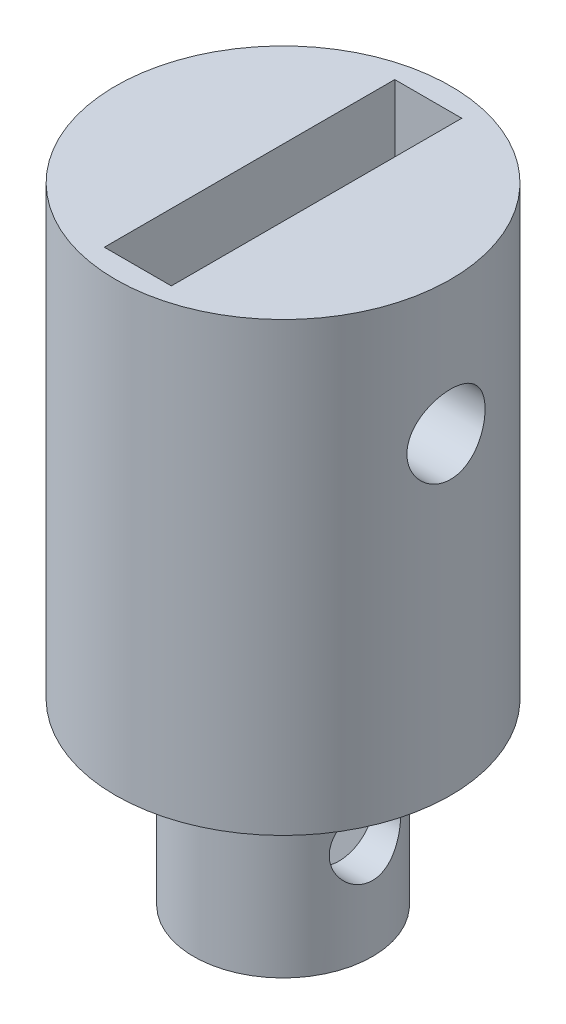
ISO-10303-21;
HEADER;
FILE_DESCRIPTION(('STEP AP214'),'2;1');
FILE_NAME('part.step','',(''),(''),'','','');
FILE_SCHEMA(('AUTOMOTIVE_DESIGN { 1 0 10303 214 1 1 1 1 }'));
ENDSEC;
DATA;
#1=APPLICATION_CONTEXT('core data for automotive mechanical design processes');
#2=APPLICATION_PROTOCOL_DEFINITION('international standard','automotive_design',2000,#1);
#3=PRODUCT_CONTEXT('',#1,'mechanical');
#4=PRODUCT('Part','Part','',(#3));
#5=PRODUCT_RELATED_PRODUCT_CATEGORY('part','',(#4));
#6=PRODUCT_DEFINITION_FORMATION('','',#4);
#7=PRODUCT_DEFINITION_CONTEXT('part definition',#1,'design');
#8=PRODUCT_DEFINITION('design','',#6,#7);
#9=PRODUCT_DEFINITION_SHAPE('','',#8);
#10=(LENGTH_UNIT() NAMED_UNIT(*) SI_UNIT(.MILLI.,.METRE.));
#11=(NAMED_UNIT(*) PLANE_ANGLE_UNIT() SI_UNIT($,.RADIAN.));
#12=(NAMED_UNIT(*) SI_UNIT($,.STERADIAN.) SOLID_ANGLE_UNIT());
#13=UNCERTAINTY_MEASURE_WITH_UNIT(LENGTH_MEASURE(1.E-05),#10,'distance_accuracy_value','');
#14=(GEOMETRIC_REPRESENTATION_CONTEXT(3) GLOBAL_UNCERTAINTY_ASSIGNED_CONTEXT((#13)) GLOBAL_UNIT_ASSIGNED_CONTEXT((#10,
#11,#12)) REPRESENTATION_CONTEXT('',''));
#15=CARTESIAN_POINT('',(0.,0.,0.));
#16=DIRECTION('',(0.,0.,1.));
#17=DIRECTION('',(1.,0.,0.));
#18=AXIS2_PLACEMENT_3D('',#15,#16,#17);
#19=CARTESIAN_POINT('',(0.,20.,0.));
#20=DIRECTION('',(0.,-1.,0.));
#21=DIRECTION('',(0.,0.,-1.));
#22=AXIS2_PLACEMENT_3D('',#19,#20,#21);
#23=CYLINDRICAL_SURFACE('',#22,7.5);
#24=CARTESIAN_POINT('',(-7.5,12.25,0.));
#25=CARTESIAN_POINT('',(-7.49999825577596,12.2500030618777,-0.0968920689760757));
#26=CARTESIAN_POINT('',(-7.4981034715083,12.2580740513045,-0.193819815225522));
#27=CARTESIAN_POINT('',(-7.49072806388341,12.2901045766339,-0.384910889611755));
#28=CARTESIAN_POINT('',(-7.48524511796865,12.3140744037268,-0.479072385923468));
#29=CARTESIAN_POINT('',(-7.47130237255715,12.3771021121917,-0.661842669774767));
#30=CARTESIAN_POINT('',(-7.46284589581215,12.4161431570795,-0.750457525699834));
#31=CARTESIAN_POINT('',(-7.44386329828026,12.5081489574349,-0.91987807027651));
#32=CARTESIAN_POINT('',(-7.43333717435647,12.5611137340062,-1.00068374709176));
#33=CARTESIAN_POINT('',(-7.41115055069133,12.6804779499764,-1.15365744906099));
#34=CARTESIAN_POINT('',(-7.39947439919204,12.7470816827131,-1.22566380724544));
#35=CARTESIAN_POINT('',(-7.37641108271656,12.891395128878,-1.35759154808836));
#36=CARTESIAN_POINT('',(-7.36502394655403,12.9691059445554,-1.41751172990911));
#37=CARTESIAN_POINT('',(-7.34367214380394,13.1346500213109,-1.52430064665384));
#38=CARTESIAN_POINT('',(-7.33372745319133,13.2225996554056,-1.57099333387897));
#39=CARTESIAN_POINT('',(-7.31661287650471,13.4053683609194,-1.6488712963096));
#40=CARTESIAN_POINT('',(-7.30944260894164,13.5001864857763,-1.68005870369203));
#41=CARTESIAN_POINT('',(-7.29884882817841,13.6922357720839,-1.72549870554403));
#42=CARTESIAN_POINT('',(-7.29536161619364,13.789395131124,-1.74003958773343));
#43=CARTESIAN_POINT('',(-7.29233777147282,13.9848320111131,-1.75267090949772));
#44=CARTESIAN_POINT('',(-7.29280058314518,14.0831093728671,-1.75076366258806));
#45=CARTESIAN_POINT('',(-7.29756700759255,14.2758198714321,-1.73078396258508));
#46=CARTESIAN_POINT('',(-7.30179013507032,14.3702904232992,-1.71305023914493));
#47=CARTESIAN_POINT('',(-7.31347364560974,14.5548773245081,-1.66245929848704));
#48=CARTESIAN_POINT('',(-7.32093423258011,14.6449933991894,-1.62960112866058));
#49=CARTESIAN_POINT('',(-7.33832888287955,14.8192456061221,-1.54939319136076));
#50=CARTESIAN_POINT('',(-7.34828446187752,14.9033210783129,-1.50191650068999));
#51=CARTESIAN_POINT('',(-7.36953464123461,15.0624355576315,-1.39390822624992));
#52=CARTESIAN_POINT('',(-7.38082944761958,15.1374731707923,-1.33337463263883));
#53=CARTESIAN_POINT('',(-7.40382788817507,15.2783281140719,-1.19919515127698));
#54=CARTESIAN_POINT('',(-7.41553472758942,15.3438717542807,-1.12526218832138));
#55=CARTESIAN_POINT('',(-7.43778511341053,15.4616781557077,-0.967317488194552));
#56=CARTESIAN_POINT('',(-7.44832863270767,15.5139406074624,-0.883305516240615));
#57=CARTESIAN_POINT('',(-7.46710641661403,15.6037833646967,-0.707228133730521));
#58=CARTESIAN_POINT('',(-7.47533441580223,15.6413239410212,-0.615141740504017));
#59=CARTESIAN_POINT('',(-7.48850806607517,15.7003196393313,-0.425732018971087));
#60=CARTESIAN_POINT('',(-7.49345426202045,15.7217774315337,-0.328409562882732));
#61=CARTESIAN_POINT('',(-7.49942805503466,15.7475914204155,-0.133634485575039));
#62=CARTESIAN_POINT('',(-7.50054117979009,15.7523209428514,-0.036233895819054));
#63=CARTESIAN_POINT('',(-7.49896485478385,15.7455614567116,0.157966056910927));
#64=CARTESIAN_POINT('',(-7.49627570064511,15.7340737090105,0.254765466038351));
#65=CARTESIAN_POINT('',(-7.4874513357351,15.6955146187151,0.443751070191776));
#66=CARTESIAN_POINT('',(-7.4813602349345,15.6686426400312,0.535980185830076));
#67=CARTESIAN_POINT('',(-7.46641550234956,15.6003020657904,0.714619874430139));
#68=CARTESIAN_POINT('',(-7.45756161410129,15.5588321150879,0.801029906312502));
#69=CARTESIAN_POINT('',(-7.43786494800546,15.4617196230682,0.96709608204095));
#70=CARTESIAN_POINT('',(-7.42699280446074,15.405862366847,1.04662310111654));
#71=CARTESIAN_POINT('',(-7.40451901177755,15.2818397652948,1.19530848786501));
#72=CARTESIAN_POINT('',(-7.39291725403761,15.2136725848191,1.26446530674697));
#73=CARTESIAN_POINT('',(-7.36999067066486,15.0652421305742,1.39195179817296));
#74=CARTESIAN_POINT('',(-7.35867690401401,14.9847533715037,1.45002132371627));
#75=CARTESIAN_POINT('',(-7.33788489047587,14.8149489854474,1.55182334690519));
#76=CARTESIAN_POINT('',(-7.32840656171112,14.7256337524723,1.59555648414632));
#77=CARTESIAN_POINT('',(-7.31245631829528,14.5411994250047,1.66713168175486));
#78=CARTESIAN_POINT('',(-7.30596688379596,14.4461179477458,1.69506657175421));
#79=CARTESIAN_POINT('',(-7.29670338236506,14.2524368953119,1.73451374261782));
#80=CARTESIAN_POINT('',(-7.29392862516582,14.1538379772507,1.74602907461822));
#81=CARTESIAN_POINT('',(-7.2924563335065,13.958554313125,1.75216673875871));
#82=CARTESIAN_POINT('',(-7.29365890731389,13.861883104439,1.74720293679523));
#83=CARTESIAN_POINT('',(-7.29977758521158,13.6707962002614,1.72145838535237));
#84=CARTESIAN_POINT('',(-7.30469363239422,13.5763804702282,1.70067787825835));
#85=CARTESIAN_POINT('',(-7.31763341770559,13.3928681369245,1.64410189522673));
#86=CARTESIAN_POINT('',(-7.3256430460587,13.3037494731853,1.60837453100366));
#87=CARTESIAN_POINT('',(-7.34387130010679,13.1327125050603,1.52297483551587));
#88=CARTESIAN_POINT('',(-7.35409019149527,13.0507950683869,1.47330082676528));
#89=CARTESIAN_POINT('',(-7.37587784566718,12.8944636211478,1.36007929334343));
#90=CARTESIAN_POINT('',(-7.38747214966726,12.8202642448876,1.29624027185383));
#91=CARTESIAN_POINT('',(-7.41054163753682,12.6834961729898,1.15708154748275));
#92=CARTESIAN_POINT('',(-7.42201679296978,12.6209301962101,1.08175916827681));
#93=CARTESIAN_POINT('',(-7.44376280686385,12.5082852342285,0.920389220167817));
#94=CARTESIAN_POINT('',(-7.45401268438621,12.4584107326287,0.834195898350605));
#95=CARTESIAN_POINT('',(-7.47193835175222,12.3739380392255,0.654422829609414));
#96=CARTESIAN_POINT('',(-7.47961615964697,12.3393278642193,0.560848945048673));
#97=CARTESIAN_POINT('',(-7.49026740611945,12.292074730493,0.389410230226078));
#98=CARTESIAN_POINT('',(-7.49389343265844,12.2763285651487,0.312426185720358));
#99=CARTESIAN_POINT('',(-7.49876036826803,12.2552902570785,0.156969176166677));
#100=CARTESIAN_POINT('',(-7.50000141306846,12.2499975194455,0.0784962961053608));
#101=CARTESIAN_POINT('',(-7.5,12.25,0.));
#102=B_SPLINE_CURVE_WITH_KNOTS('',3,(#24,#25,#26,#27,#28,#29,#30,#31,#32,#33,#34,#35,#36,#37,
#38,#39,#40,#41,#42,#43,#44,#45,#46,#47,#48,#49,#50,#51,#52,#53,#54,#55,#56,#57,#58,#59,#60,#61,
#62,#63,#64,#65,#66,#67,#68,#69,#70,#71,#72,#73,#74,#75,#76,#77,#78,#79,#80,#81,#82,#83,#84,#85,
#86,#87,#88,#89,#90,#91,#92,#93,#94,#95,#96,#97,#98,#99,#100,#101),.UNSPECIFIED.,.T.,.F.,(4,2,2,
2,2,2,2,2,2,2,2,2,2,2,2,2,2,2,2,2,2,2,2,2,2,2,2,2,2,2,2,2,2,2,2,2,2,2,4),(0.,0.290388732399198,
0.580965614771191,0.87121882049522,1.16147246614851,1.45644189297896,1.75144061245837,
2.05019856191815,2.34891541691671,2.64237682397785,2.93579695482906,3.22308381491298,
3.51038877215025,3.80026212118231,4.09018012214059,4.38726289257607,4.6843525846687,
4.98223858898698,5.28007512447419,5.57122135923558,5.86234495894804,6.14977863536887,
6.43723900161202,6.72926673904459,7.02133804751611,7.31959128203367,7.61783120863844,
7.91429998398243,8.21071366134324,8.49973992092952,8.78876175138095,9.07648063468675,
9.36423413931506,9.65857330060458,9.95298116608024,10.2518686566731,10.5505210872652,
10.7857904701329,11.0210464633731),.UNSPECIFIED.);
#103=CARTESIAN_POINT('',(-7.5,12.25,0.));
#104=VERTEX_POINT('',#103);
#105=EDGE_CURVE('E184',#104,#104,#102,.T.);
#106=ORIENTED_EDGE('',*,*,#105,.T.);
#107=EDGE_LOOP('',(#106));
#108=FACE_BOUND('',#107,.T.);
#109=CARTESIAN_POINT('',(7.29297607290741,14.,-1.75));
#110=CARTESIAN_POINT('',(7.29297800893518,13.9031484123783,-1.74999691121486));
#111=CARTESIAN_POINT('',(7.29492641392344,13.8062610851059,-1.74193243452759));
#112=CARTESIAN_POINT('',(7.3024927037543,13.6152538901727,-1.70993011922931));
#113=CARTESIAN_POINT('',(7.3081130063061,13.5211358886348,-1.68598182198251));
#114=CARTESIAN_POINT('',(7.32235269223616,13.3384578014423,-1.62301703909513));
#115=CARTESIAN_POINT('',(7.33096852300285,13.2498912780989,-1.58401839673764));
#116=CARTESIAN_POINT('',(7.35022414270218,13.080552467565,-1.49211260074413));
#117=CARTESIAN_POINT('',(7.36086394835487,12.9997802447715,-1.43920533220768));
#118=CARTESIAN_POINT('',(7.38319707914479,12.8467719210912,-1.31990053028654));
#119=CARTESIAN_POINT('',(7.39490542720197,12.7747073624583,-1.2532857659187));
#120=CARTESIAN_POINT('',(7.41792544005529,12.6426663965119,-1.10892542263261));
#121=CARTESIAN_POINT('',(7.42923707123065,12.5826910116912,-1.03117890314965));
#122=CARTESIAN_POINT('',(7.4503539477019,12.4758417536357,-0.865600431056947));
#123=CARTESIAN_POINT('',(7.4601393966088,12.4291344782347,-0.777658228910629));
#124=CARTESIAN_POINT('',(7.47693089106183,12.3512275336726,-0.594905513322861));
#125=CARTESIAN_POINT('',(7.48393729246054,12.320025878912,-0.500095881084696));
#126=CARTESIAN_POINT('',(7.49427508053088,12.2745599124039,-0.308085528685821));
#127=CARTESIAN_POINT('',(7.49766948813477,12.2600048077259,-0.210957116045304));
#128=CARTESIAN_POINT('',(7.50061975184774,12.2473342975663,-0.0155817884290656));
#129=CARTESIAN_POINT('',(7.50017610507374,12.2492167630389,0.0826649800474678));
#130=CARTESIAN_POINT('',(7.49554784718929,12.2691547299085,0.275478042541461));
#131=CARTESIAN_POINT('',(7.49143578472275,12.2868966003876,0.370078768104856));
#132=CARTESIAN_POINT('',(7.48001618746918,12.3375480150585,0.554921689175643));
#133=CARTESIAN_POINT('',(7.47270849582506,12.3704583037947,0.64516367049307));
#134=CARTESIAN_POINT('',(7.45560461806821,12.4507789777603,0.819578014218367));
#135=CARTESIAN_POINT('',(7.44578870572467,12.4983049425984,0.903695136551195));
#136=CARTESIAN_POINT('',(7.42473958086035,12.6064210603093,1.06287255429869));
#137=CARTESIAN_POINT('',(7.41350615083412,12.6670132190867,1.13793145634496));
#138=CARTESIAN_POINT('',(7.39053896048856,12.8012376648232,1.27872977581917));
#139=CARTESIAN_POINT('',(7.37879965003309,12.8751443168309,1.34420698669887));
#140=CARTESIAN_POINT('',(7.35638991886421,13.0330116098795,1.46189143870384));
#141=CARTESIAN_POINT('',(7.34571953582998,13.1169726051023,1.51409821215242));
#142=CARTESIAN_POINT('',(7.32663858626934,13.2930296350349,1.60389910082545));
#143=CARTESIAN_POINT('',(7.31823665891522,13.3851550429355,1.64143758946765));
#144=CARTESIAN_POINT('',(7.30475908797368,13.5746504600491,1.7004174956462));
#145=CARTESIAN_POINT('',(7.29968283511952,13.6720195050837,1.721861861746));
#146=CARTESIAN_POINT('',(7.29355731632272,13.8668261440733,1.74762540592416));
#147=CARTESIAN_POINT('',(7.29241766492437,13.9642101121598,1.75232903411415));
#148=CARTESIAN_POINT('',(7.29404956128176,14.1583708912816,1.74552372119433));
#149=CARTESIAN_POINT('',(7.29682079982655,14.2551477497098,1.73401606181531));
#150=CARTESIAN_POINT('',(7.30587629688283,14.4439687869127,1.69545004676236));
#151=CARTESIAN_POINT('',(7.31211146543437,14.5360598938308,1.66860884705884));
#152=CARTESIAN_POINT('',(7.32734694319755,14.714437002856,1.60037532419597));
#153=CARTESIAN_POINT('',(7.33634754633895,14.8007223867012,1.55898145420941));
#154=CARTESIAN_POINT('',(7.35629458570697,14.9666867768236,1.46198984444796));
#155=CARTESIAN_POINT('',(7.36727203523835,15.046225409019,1.40615842122144));
#156=CARTESIAN_POINT('',(7.38985672649086,15.1949460014034,1.28217762730628));
#157=CARTESIAN_POINT('',(7.40146405762252,15.2641264860057,1.21402650464151));
#158=CARTESIAN_POINT('',(7.42430240366142,15.3916885153171,1.06558989070294));
#159=CARTESIAN_POINT('',(7.43551998051045,15.4498061910035,0.985075205098597));
#160=CARTESIAN_POINT('',(7.45605467452934,15.5516927184385,0.81520374462249));
#161=CARTESIAN_POINT('',(7.46537188616728,15.5954622835042,0.725847409601519));
#162=CARTESIAN_POINT('',(7.48100007174939,15.6670573984016,0.541419656487201));
#163=CARTESIAN_POINT('',(7.48733138363848,15.6949910832885,0.446392019695064));
#164=CARTESIAN_POINT('',(7.49636287016946,15.7344539867907,0.252826481581442));
#165=CARTESIAN_POINT('',(7.49906364994735,15.7459859392605,0.154289168063098));
#166=CARTESIAN_POINT('',(7.50050874838961,15.7521810424285,-0.0410057930174482));
#167=CARTESIAN_POINT('',(7.4993449696472,15.7472360204056,-0.137750533597031));
#168=CARTESIAN_POINT('',(7.49339172671828,15.7215034691329,-0.328989601527529));
#169=CARTESIAN_POINT('',(7.48860234600248,15.7007163046099,-0.423483980635915));
#170=CARTESIAN_POINT('',(7.47594625620643,15.6440878646757,-0.607188231850142));
#171=CARTESIAN_POINT('',(7.46809234162874,15.6083091341329,-0.696418322165903));
#172=CARTESIAN_POINT('',(7.45014037171465,15.5227717153195,-0.867657352089335));
#173=CARTESIAN_POINT('',(7.44004206755177,15.4730114768134,-0.949665489619465));
#174=CARTESIAN_POINT('',(7.41842885049258,15.3596831891213,-1.10602054186471));
#175=CARTESIAN_POINT('',(7.40688836677777,15.2958438633922,-1.1801673087093));
#176=CARTESIAN_POINT('',(7.38381847206244,15.156707621813,-1.31682912964441));
#177=CARTESIAN_POINT('',(7.37228906448377,15.0814078915467,-1.37934131814026));
#178=CARTESIAN_POINT('',(7.35034314946524,14.9200667104971,-1.49191307180048));
#179=CARTESIAN_POINT('',(7.339946936036,14.8338752912573,-1.54176192159397));
#180=CARTESIAN_POINT('',(7.32170708592057,14.6541094882918,-1.62618714943188));
#181=CARTESIAN_POINT('',(7.31386142453851,14.5605410343338,-1.66077564937584));
#182=CARTESIAN_POINT('',(7.30296173657243,14.389156249558,-1.70798052325093));
#183=CARTESIAN_POINT('',(7.29924342453176,14.3122234696682,-1.72370580247522));
#184=CARTESIAN_POINT('',(7.29424988616654,14.1568682120887,-1.74471646048675));
#185=CARTESIAN_POINT('',(7.29297450480401,14.0784458292541,-1.75000250178977));
#186=CARTESIAN_POINT('',(7.29297607290741,14.,-1.75));
#187=B_SPLINE_CURVE_WITH_KNOTS('',3,(#109,#110,#111,#112,#113,#114,#115,#116,#117,#118,#119,
#120,#121,#122,#123,#124,#125,#126,#127,#128,#129,#130,#131,#132,#133,#134,#135,#136,#137,#138,
#139,#140,#141,#142,#143,#144,#145,#146,#147,#148,#149,#150,#151,#152,#153,#154,#155,#156,#157,
#158,#159,#160,#161,#162,#163,#164,#165,#166,#167,#168,#169,#170,#171,#172,#173,#174,#175,#176,
#177,#178,#179,#180,#181,#182,#183,#184,#185,#186),.UNSPECIFIED.,.T.,.F.,(4,2,2,2,2,2,2,2,2,2,2,
2,2,2,2,2,2,2,2,2,2,2,2,2,2,2,2,2,2,2,2,2,2,2,2,2,2,2,4),(0.,0.290267014023683,
0.580725343150865,0.870840365403751,1.16095778439899,1.45608637339859,1.75123991367709,
2.04995037963246,2.34862258383274,2.64199362879946,2.93532667599054,3.22298412892172,
3.5106557030727,3.8006633505479,4.09071555134698,4.38762339815685,4.68454170714155,
4.98257533883123,5.28055435519578,5.57164449350048,5.86271161831849,6.14975532473344,
6.43682955072413,6.72887792242813,7.02096785885331,7.31933164493485,7.61768059559088,
7.91396694700852,8.21020390738007,8.49944701890128,8.7886834715018,9.07672505792188,
9.36479859429994,9.65900183476419,9.95327744181983,10.2521691042319,10.550822915826,
10.7859422608756,11.021046683832),.UNSPECIFIED.);
#188=CARTESIAN_POINT('',(7.29297607290741,14.,-1.75));
#189=VERTEX_POINT('',#188);
#190=EDGE_CURVE('E176',#189,#189,#187,.T.);
#191=ORIENTED_EDGE('',*,*,#190,.T.);
#192=EDGE_LOOP('',(#191));
#193=FACE_BOUND('',#192,.T.);
#194=CARTESIAN_POINT('',(0.,20.,0.));
#195=DIRECTION('',(0.,1.,0.));
#196=DIRECTION('',(0.,0.,1.));
#197=AXIS2_PLACEMENT_3D('',#194,#195,#196);
#198=CIRCLE('',#197,7.5);
#199=CARTESIAN_POINT('',(0.,20.,7.5));
#200=VERTEX_POINT('',#199);
#201=EDGE_CURVE('E51',#200,#200,#198,.T.);
#202=ORIENTED_EDGE('',*,*,#201,.F.);
#203=EDGE_LOOP('',(#202));
#204=FACE_BOUND('',#203,.T.);
#205=CARTESIAN_POINT('',(0.,0.,0.));
#206=DIRECTION('',(0.,1.,0.));
#207=DIRECTION('',(0.,0.,1.));
#208=AXIS2_PLACEMENT_3D('',#205,#206,#207);
#209=CIRCLE('',#208,7.5);
#210=CARTESIAN_POINT('',(0.,0.,7.5));
#211=VERTEX_POINT('',#210);
#212=EDGE_CURVE('E243',#211,#211,#209,.T.);
#213=ORIENTED_EDGE('',*,*,#212,.T.);
#214=EDGE_LOOP('',(#213));
#215=FACE_BOUND('',#214,.T.);
#216=ADVANCED_FACE('F41',(#108,#193,#204,#215),#23,.T.);
#217=CARTESIAN_POINT('',(0.,20.,0.));
#218=DIRECTION('',(0.,1.,0.));
#219=DIRECTION('',(0.,0.,1.));
#220=AXIS2_PLACEMENT_3D('',#217,#218,#219);
#221=PLANE('',#220);
#222=DIRECTION('',(0.,0.,1.));
#223=VECTOR('',#222,1.);
#224=CARTESIAN_POINT('',(-1.5,20.,-6.5));
#225=LINE('',#224,#223);
#226=CARTESIAN_POINT('',(-1.5,20.,-6.5));
#227=VERTEX_POINT('',#226);
#228=CARTESIAN_POINT('',(-1.5,20.,6.5));
#229=VERTEX_POINT('',#228);
#230=EDGE_CURVE('E67',#227,#229,#225,.T.);
#231=ORIENTED_EDGE('',*,*,#230,.F.);
#232=DIRECTION('',(-1.,0.,0.));
#233=VECTOR('',#232,1.);
#234=CARTESIAN_POINT('',(-1.5,20.,-6.5));
#235=LINE('',#234,#233);
#236=CARTESIAN_POINT('',(1.5,20.,-6.5));
#237=VERTEX_POINT('',#236);
#238=EDGE_CURVE('E436',#237,#227,#235,.T.);
#239=ORIENTED_EDGE('',*,*,#238,.F.);
#240=DIRECTION('',(0.,0.,-1.));
#241=VECTOR('',#240,1.);
#242=CARTESIAN_POINT('',(1.5,20.,-6.5));
#243=LINE('',#242,#241);
#244=CARTESIAN_POINT('',(1.5,20.,6.5));
#245=VERTEX_POINT('',#244);
#246=EDGE_CURVE('E428',#245,#237,#243,.T.);
#247=ORIENTED_EDGE('',*,*,#246,.F.);
#248=DIRECTION('',(1.,0.,0.));
#249=VECTOR('',#248,1.);
#250=CARTESIAN_POINT('',(-1.5,20.,6.5));
#251=LINE('',#250,#249);
#252=EDGE_CURVE('E437',#229,#245,#251,.T.);
#253=ORIENTED_EDGE('',*,*,#252,.F.);
#254=EDGE_LOOP('',(#231,#239,#247,#253));
#255=FACE_BOUND('',#254,.T.);
#256=ORIENTED_EDGE('',*,*,#201,.T.);
#257=EDGE_LOOP('',(#256));
#258=FACE_BOUND('',#257,.T.);
#259=ADVANCED_FACE('F220',(#255,#258),#221,.T.);
#260=CARTESIAN_POINT('',(0.,0.,0.));
#261=DIRECTION('',(0.,1.,0.));
#262=DIRECTION('',(0.,0.,1.));
#263=AXIS2_PLACEMENT_3D('',#260,#261,#262);
#264=PLANE('',#263);
#265=CARTESIAN_POINT('',(0.,0.,0.));
#266=DIRECTION('',(0.,-1.,0.));
#267=DIRECTION('',(0.,0.,-1.));
#268=AXIS2_PLACEMENT_3D('',#265,#266,#267);
#269=CIRCLE('',#268,4.);
#270=CARTESIAN_POINT('',(0.,0.,-4.));
#271=VERTEX_POINT('',#270);
#272=EDGE_CURVE('E11',#271,#271,#269,.T.);
#273=ORIENTED_EDGE('',*,*,#272,.F.);
#274=EDGE_LOOP('',(#273));
#275=FACE_BOUND('',#274,.T.);
#276=ORIENTED_EDGE('',*,*,#212,.F.);
#277=EDGE_LOOP('',(#276));
#278=FACE_BOUND('',#277,.T.);
#279=ADVANCED_FACE('F218',(#275,#278),#264,.F.);
#280=CARTESIAN_POINT('',(-1.5,10.,-6.5));
#281=DIRECTION('',(-1.,0.,0.));
#282=DIRECTION('',(0.,0.,1.));
#283=AXIS2_PLACEMENT_3D('',#280,#281,#282);
#284=PLANE('',#283);
#285=CARTESIAN_POINT('',(-1.5,14.,0.));
#286=DIRECTION('',(-1.,0.,0.));
#287=DIRECTION('',(0.,0.,1.));
#288=AXIS2_PLACEMENT_3D('',#285,#286,#287);
#289=CIRCLE('',#288,1.75);
#290=CARTESIAN_POINT('',(-1.5,14.,1.75));
#291=VERTEX_POINT('',#290);
#292=EDGE_CURVE('E172',#291,#291,#289,.T.);
#293=ORIENTED_EDGE('',*,*,#292,.T.);
#294=EDGE_LOOP('',(#293));
#295=FACE_BOUND('',#294,.T.);
#296=ORIENTED_EDGE('',*,*,#230,.T.);
#297=DIRECTION('',(0.,1.,0.));
#298=VECTOR('',#297,1.);
#299=CARTESIAN_POINT('',(-1.5,10.,6.5));
#300=LINE('',#299,#298);
#301=CARTESIAN_POINT('',(-1.5,10.,6.5));
#302=VERTEX_POINT('',#301);
#303=EDGE_CURVE('E452',#302,#229,#300,.T.);
#304=ORIENTED_EDGE('',*,*,#303,.F.);
#305=DIRECTION('',(0.,0.,1.));
#306=VECTOR('',#305,1.);
#307=CARTESIAN_POINT('',(-1.5,10.,-6.5));
#308=LINE('',#307,#306);
#309=CARTESIAN_POINT('',(-1.5,10.,-6.5));
#310=VERTEX_POINT('',#309);
#311=EDGE_CURVE('E442',#310,#302,#308,.T.);
#312=ORIENTED_EDGE('',*,*,#311,.F.);
#313=DIRECTION('',(0.,1.,0.));
#314=VECTOR('',#313,1.);
#315=CARTESIAN_POINT('',(-1.5,10.,-6.5));
#316=LINE('',#315,#314);
#317=EDGE_CURVE('E245',#310,#227,#316,.T.);
#318=ORIENTED_EDGE('',*,*,#317,.T.);
#319=EDGE_LOOP('',(#296,#304,#312,#318));
#320=FACE_BOUND('',#319,.T.);
#321=ADVANCED_FACE('F208',(#295,#320),#284,.F.);
#322=CARTESIAN_POINT('',(-1.5,10.,-6.5));
#323=DIRECTION('',(0.,0.,-1.));
#324=DIRECTION('',(-1.,0.,0.));
#325=AXIS2_PLACEMENT_3D('',#322,#323,#324);
#326=PLANE('',#325);
#327=ORIENTED_EDGE('',*,*,#238,.T.);
#328=ORIENTED_EDGE('',*,*,#317,.F.);
#329=DIRECTION('',(-1.,0.,0.));
#330=VECTOR('',#329,1.);
#331=CARTESIAN_POINT('',(-1.5,10.,-6.5));
#332=LINE('',#331,#330);
#333=CARTESIAN_POINT('',(1.5,10.,-6.5));
#334=VERTEX_POINT('',#333);
#335=EDGE_CURVE('E454',#334,#310,#332,.T.);
#336=ORIENTED_EDGE('',*,*,#335,.F.);
#337=DIRECTION('',(0.,1.,0.));
#338=VECTOR('',#337,1.);
#339=CARTESIAN_POINT('',(1.5,10.,-6.5));
#340=LINE('',#339,#338);
#341=EDGE_CURVE('E250',#334,#237,#340,.T.);
#342=ORIENTED_EDGE('',*,*,#341,.T.);
#343=EDGE_LOOP('',(#327,#328,#336,#342));
#344=FACE_BOUND('',#343,.T.);
#345=ADVANCED_FACE('F204',(#344),#326,.F.);
#346=CARTESIAN_POINT('',(1.5,10.,-6.5));
#347=DIRECTION('',(1.,0.,0.));
#348=DIRECTION('',(0.,0.,-1.));
#349=AXIS2_PLACEMENT_3D('',#346,#347,#348);
#350=PLANE('',#349);
#351=CARTESIAN_POINT('',(1.5,14.,0.));
#352=DIRECTION('',(1.,0.,0.));
#353=DIRECTION('',(0.,0.,-1.));
#354=AXIS2_PLACEMENT_3D('',#351,#352,#353);
#355=CIRCLE('',#354,1.75);
#356=CARTESIAN_POINT('',(1.5,14.,-1.75));
#357=VERTEX_POINT('',#356);
#358=EDGE_CURVE('E170',#357,#357,#355,.T.);
#359=ORIENTED_EDGE('',*,*,#358,.T.);
#360=EDGE_LOOP('',(#359));
#361=FACE_BOUND('',#360,.T.);
#362=ORIENTED_EDGE('',*,*,#246,.T.);
#363=ORIENTED_EDGE('',*,*,#341,.F.);
#364=DIRECTION('',(0.,0.,-1.));
#365=VECTOR('',#364,1.);
#366=CARTESIAN_POINT('',(1.5,10.,-6.5));
#367=LINE('',#366,#365);
#368=CARTESIAN_POINT('',(1.5,10.,6.5));
#369=VERTEX_POINT('',#368);
#370=EDGE_CURVE('E458',#369,#334,#367,.T.);
#371=ORIENTED_EDGE('',*,*,#370,.F.);
#372=DIRECTION('',(0.,1.,0.));
#373=VECTOR('',#372,1.);
#374=CARTESIAN_POINT('',(1.5,10.,6.5));
#375=LINE('',#374,#373);
#376=EDGE_CURVE('E432',#369,#245,#375,.T.);
#377=ORIENTED_EDGE('',*,*,#376,.T.);
#378=EDGE_LOOP('',(#362,#363,#371,#377));
#379=FACE_BOUND('',#378,.T.);
#380=ADVANCED_FACE('F207',(#361,#379),#350,.F.);
#381=CARTESIAN_POINT('',(-1.5,10.,6.5));
#382=DIRECTION('',(0.,0.,1.));
#383=DIRECTION('',(1.,0.,0.));
#384=AXIS2_PLACEMENT_3D('',#381,#382,#383);
#385=PLANE('',#384);
#386=ORIENTED_EDGE('',*,*,#252,.T.);
#387=ORIENTED_EDGE('',*,*,#376,.F.);
#388=DIRECTION('',(1.,0.,0.));
#389=VECTOR('',#388,1.);
#390=CARTESIAN_POINT('',(-1.5,10.,6.5));
#391=LINE('',#390,#389);
#392=EDGE_CURVE('E446',#302,#369,#391,.T.);
#393=ORIENTED_EDGE('',*,*,#392,.F.);
#394=ORIENTED_EDGE('',*,*,#303,.T.);
#395=EDGE_LOOP('',(#386,#387,#393,#394));
#396=FACE_BOUND('',#395,.T.);
#397=ADVANCED_FACE('F202',(#396),#385,.F.);
#398=CARTESIAN_POINT('',(0.,10.,0.));
#399=DIRECTION('',(0.,1.,0.));
#400=DIRECTION('',(0.,0.,1.));
#401=AXIS2_PLACEMENT_3D('',#398,#399,#400);
#402=PLANE('',#401);
#403=ORIENTED_EDGE('',*,*,#311,.T.);
#404=ORIENTED_EDGE('',*,*,#392,.T.);
#405=ORIENTED_EDGE('',*,*,#370,.T.);
#406=ORIENTED_EDGE('',*,*,#335,.T.);
#407=EDGE_LOOP('',(#403,#404,#405,#406));
#408=FACE_BOUND('',#407,.T.);
#409=ADVANCED_FACE('F198',(#408),#402,.T.);
#410=CARTESIAN_POINT('',(-7.5,14.,0.));
#411=DIRECTION('',(1.,0.,0.));
#412=DIRECTION('',(0.,0.,-1.));
#413=AXIS2_PLACEMENT_3D('',#410,#411,#412);
#414=CYLINDRICAL_SURFACE('',#413,1.75);
#415=ORIENTED_EDGE('',*,*,#358,.F.);
#416=EDGE_LOOP('',(#415));
#417=FACE_BOUND('',#416,.T.);
#418=ORIENTED_EDGE('',*,*,#190,.F.);
#419=EDGE_LOOP('',(#418));
#420=FACE_BOUND('',#419,.T.);
#421=ADVANCED_FACE('F194',(#417,#420),#414,.F.);
#422=ORIENTED_EDGE('',*,*,#292,.F.);
#423=EDGE_LOOP('',(#422));
#424=FACE_BOUND('',#423,.T.);
#425=ORIENTED_EDGE('',*,*,#105,.F.);
#426=EDGE_LOOP('',(#425));
#427=FACE_BOUND('',#426,.T.);
#428=ADVANCED_FACE('F189',(#424,#427),#414,.F.);
#429=CARTESIAN_POINT('',(0.,-8.,0.));
#430=DIRECTION('',(0.,1.,0.));
#431=DIRECTION('',(0.,0.,1.));
#432=AXIS2_PLACEMENT_3D('',#429,#430,#431);
#433=CYLINDRICAL_SURFACE('',#432,4.);
#434=CARTESIAN_POINT('',(-3.66606055596467,-3.45,-1.6));
#435=CARTESIAN_POINT('',(-3.66606921325137,-3.36428840152009,-1.59999060336303));
#436=CARTESIAN_POINT('',(-3.66910881987412,-3.27845557223624,-1.59307185487548));
#437=CARTESIAN_POINT('',(-3.68088731350276,-3.10925213369835,-1.56565522447418));
#438=CARTESIAN_POINT('',(-3.68964076309481,-3.02588838633561,-1.5451226435537));
#439=CARTESIAN_POINT('',(-3.71168364633037,-2.86435764642396,-1.49138802605496));
#440=CARTESIAN_POINT('',(-3.72495597085692,-2.7861723621118,-1.45823372202034));
#441=CARTESIAN_POINT('',(-3.75451732076224,-2.63649195931231,-1.38033621549729));
#442=CARTESIAN_POINT('',(-3.77080568723138,-2.56499538467931,-1.335595543414));
#443=CARTESIAN_POINT('',(-3.80560692040826,-2.42659167820684,-1.23305757966994));
#444=CARTESIAN_POINT('',(-3.82419134366997,-2.36011486165643,-1.17470348618186));
#445=CARTESIAN_POINT('',(-3.86089965583049,-2.2375768021477,-1.04776728461924));
#446=CARTESIAN_POINT('',(-3.87902338189098,-2.18151919896811,-0.979181617340544));
#447=CARTESIAN_POINT('',(-3.91362726325484,-2.07927488241384,-0.830405048285103));
#448=CARTESIAN_POINT('',(-3.93001442946855,-2.03356455882348,-0.749863172489826));
#449=CARTESIAN_POINT('',(-3.95843142105237,-1.95652514528815,-0.581460258300097));
#450=CARTESIAN_POINT('',(-3.97046301907739,-1.92519020337444,-0.49360221543037));
#451=CARTESIAN_POINT('',(-3.98830660006628,-1.87932681085008,-0.317573141471114));
#452=CARTESIAN_POINT('',(-3.99439149420286,-1.86405814872879,-0.229623187843685));
#453=CARTESIAN_POINT('',(-4.00064248546163,-1.84837721146985,-0.0522130629101213));
#454=CARTESIAN_POINT('',(-4.0008107901545,-1.84795939525212,0.0372465326603219));
#455=CARTESIAN_POINT('',(-3.99537570257429,-1.86158621581999,0.209785995772249));
#456=CARTESIAN_POINT('',(-3.99009597417469,-1.87481981819755,0.292941962299227));
#457=CARTESIAN_POINT('',(-3.97479433175032,-1.9139943010486,0.45573848737467));
#458=CARTESIAN_POINT('',(-3.9647720697689,-1.93993611392031,0.535378787512126));
#459=CARTESIAN_POINT('',(-3.9407745956616,-2.00410918630104,0.690318350809324));
#460=CARTESIAN_POINT('',(-3.9267420837344,-2.04251977185243,0.765534098703707));
#461=CARTESIAN_POINT('',(-3.89611668143758,-2.13037200553521,0.908646520592459));
#462=CARTESIAN_POINT('',(-3.87952291412059,-2.1798174344781,0.976540674172887));
#463=CARTESIAN_POINT('',(-3.84417309742667,-2.29211930875727,1.10781506239372));
#464=CARTESIAN_POINT('',(-3.82534661216192,-2.35564311406706,1.17060627621891));
#465=CARTESIAN_POINT('',(-3.78849328771823,-2.49239245745677,1.28488593230826));
#466=CARTESIAN_POINT('',(-3.77046671181078,-2.56562115852333,1.33637067500773));
#467=CARTESIAN_POINT('',(-3.7367751795345,-2.72233521792716,1.42792335099435));
#468=CARTESIAN_POINT('',(-3.72119131345105,-2.80605186438706,1.46762772138792));
#469=CARTESIAN_POINT('',(-3.69510072373859,-2.97977239236961,1.53214100797301));
#470=CARTESIAN_POINT('',(-3.68459070338672,-3.06977214781668,1.55695959872352));
#471=CARTESIAN_POINT('',(-3.67063807738052,-3.24762862194884,1.58956395906557));
#472=CARTESIAN_POINT('',(-3.6668029315846,-3.33528035769613,1.59829767744673));
#473=CARTESIAN_POINT('',(-3.66551598301679,-3.51086176621436,1.60124906115921));
#474=CARTESIAN_POINT('',(-3.6680622444997,-3.59879134662227,1.59547112847431));
#475=CARTESIAN_POINT('',(-3.67884835485706,-3.7671671479639,1.57042631583082));
#476=CARTESIAN_POINT('',(-3.68675566238216,-3.8477543499196,1.55194644961876));
#477=CARTESIAN_POINT('',(-3.70696040822297,-4.00463072382881,1.50304334952902));
#478=CARTESIAN_POINT('',(-3.71925881990995,-4.08091893848585,1.47261746744191));
#479=CARTESIAN_POINT('',(-3.7474702548796,-4.23048188623639,1.39930851158516));
#480=CARTESIAN_POINT('',(-3.76350963711308,-4.30350895095556,1.35597029461168));
#481=CARTESIAN_POINT('',(-3.7972030812627,-4.44158638995333,1.2585321795535));
#482=CARTESIAN_POINT('',(-3.8148577991685,-4.50663349823648,1.20442789878559));
#483=CARTESIAN_POINT('',(-3.85136732777118,-4.63189872687937,1.08227536934439));
#484=CARTESIAN_POINT('',(-3.87021445828162,-4.69140525223282,1.01349234355608));
#485=CARTESIAN_POINT('',(-3.9057583565405,-4.79814166128827,0.866466906695075));
#486=CARTESIAN_POINT('',(-3.92245503674592,-4.84537104527779,0.788224110774291));
#487=CARTESIAN_POINT('',(-3.95186972720228,-4.92603810116898,0.624223947201408));
#488=CARTESIAN_POINT('',(-3.96458868992219,-4.95947907533263,0.538468384795252));
#489=CARTESIAN_POINT('',(-3.98458170775432,-5.0112390819261,0.361914872735379));
#490=CARTESIAN_POINT('',(-3.99185871766035,-5.02956632115205,0.271119688235415));
#491=CARTESIAN_POINT('',(-3.9998320656841,-5.04960376130031,0.0934532082770419));
#492=CARTESIAN_POINT('',(-4.00092677395898,-5.05232010277012,0.00671239407444373));
#493=CARTESIAN_POINT('',(-3.99748833902874,-5.04371561657272,-0.165947068586595));
#494=CARTESIAN_POINT('',(-3.9929560477353,-5.0323969137715,-0.251865839515698));
#495=CARTESIAN_POINT('',(-3.97897210691404,-4.99676256931322,-0.417736721557129));
#496=CARTESIAN_POINT('',(-3.96967584507464,-4.97285684313955,-0.497791043718708));
#497=CARTESIAN_POINT('',(-3.9471595826563,-4.91315775635054,-0.652737883807152));
#498=CARTESIAN_POINT('',(-3.93393885843209,-4.87736220318372,-0.727629446613821));
#499=CARTESIAN_POINT('',(-3.90414475488046,-4.79311744120853,-0.873762433484893));
#500=CARTESIAN_POINT('',(-3.88744903782584,-4.74417896409193,-0.944696309445141));
#501=CARTESIAN_POINT('',(-3.85271522549158,-4.63576918465685,-1.07764322281926));
#502=CARTESIAN_POINT('',(-3.834676576404,-4.57629352283191,-1.13965254859661));
#503=CARTESIAN_POINT('',(-3.79790210847538,-4.44414782037996,-1.25696101206879));
#504=CARTESIAN_POINT('',(-3.77919226084307,-4.37088890127911,-1.31160710975922));
#505=CARTESIAN_POINT('',(-3.74439737180144,-4.21564629005698,-1.40787796035152));
#506=CARTESIAN_POINT('',(-3.72831263909964,-4.13366157367212,-1.44950118231999));
#507=CARTESIAN_POINT('',(-3.70207091566326,-3.97077023852154,-1.51519287013865));
#508=CARTESIAN_POINT('',(-3.69151134889319,-3.89042781219906,-1.54050201133137));
#509=CARTESIAN_POINT('',(-3.67556802883171,-3.72641166429573,-1.57817420625471));
#510=CARTESIAN_POINT('',(-3.6701698565774,-3.64274790722643,-1.59057333431041));
#511=CARTESIAN_POINT('',(-3.66659567006108,-3.52249795012966,-1.59877140664814));
#512=CARTESIAN_POINT('',(-3.66605689354686,-3.48625982320192,-1.6000039751959));
#513=CARTESIAN_POINT('',(-3.66606055596467,-3.45,-1.6));
#514=B_SPLINE_CURVE_WITH_KNOTS('',3,(#434,#435,#436,#437,#438,#439,#440,#441,#442,#443,#444,
#445,#446,#447,#448,#449,#450,#451,#452,#453,#454,#455,#456,#457,#458,#459,#460,#461,#462,#463,
#464,#465,#466,#467,#468,#469,#470,#471,#472,#473,#474,#475,#476,#477,#478,#479,#480,#481,#482,
#483,#484,#485,#486,#487,#488,#489,#490,#491,#492,#493,#494,#495,#496,#497,#498,#499,#500,#501,
#502,#503,#504,#505,#506,#507,#508,#509,#510,#511,#512,#513),.UNSPECIFIED.,.T.,.F.,(4,2,2,2,2,2,
2,2,2,2,2,2,2,2,2,2,2,2,2,2,2,2,2,2,2,2,2,2,2,2,2,2,2,2,2,2,2,2,2,4),(0.,0.257022119014123,
0.514701868657797,0.771416658634713,1.02807543059089,1.2980449462754,1.56810859478674,
1.84882135273143,2.12941973575584,2.39643346309747,2.66334756244538,2.91526915864242,
3.16720924103248,3.42294640187919,3.67877131952025,3.95139235265084,4.22410245701702,
4.50451566971661,4.78474643835289,5.04785718014744,5.3108881192156,5.55893798463324,
5.80704286916518,6.06520923717369,6.32348091615887,6.60082987392791,6.87819011877406,
7.15548389845458,7.43262700758517,7.6916883179997,7.95071041205289,8.2017759554989,
8.45288782258076,8.71509640907148,8.97741373246573,9.25597002623699,9.53455905402559,
9.78813328650469,10.040997041706,10.1497288441659),.UNSPECIFIED.);
#515=CARTESIAN_POINT('',(-3.66606055596467,-3.45,-1.6));
#516=VERTEX_POINT('',#515);
#517=EDGE_CURVE('E139',#516,#516,#514,.T.);
#518=ORIENTED_EDGE('',*,*,#517,.T.);
#519=EDGE_LOOP('',(#518));
#520=FACE_BOUND('',#519,.T.);
#521=CARTESIAN_POINT('',(3.66606055596467,-3.45,-1.6));
#522=CARTESIAN_POINT('',(3.66606921325137,-3.53571159847991,-1.59999060336303));
#523=CARTESIAN_POINT('',(3.66910881987412,-3.62154442776376,-1.59307185487548));
#524=CARTESIAN_POINT('',(3.68088731350276,-3.79074786630165,-1.56565522447418));
#525=CARTESIAN_POINT('',(3.68964076309481,-3.87411161366439,-1.5451226435537));
#526=CARTESIAN_POINT('',(3.71168364633037,-4.03564235357604,-1.49138802605496));
#527=CARTESIAN_POINT('',(3.72495597085692,-4.11382763788821,-1.45823372202034));
#528=CARTESIAN_POINT('',(3.75451732076224,-4.26350804068769,-1.38033621549729));
#529=CARTESIAN_POINT('',(3.77080568723138,-4.33500461532069,-1.335595543414));
#530=CARTESIAN_POINT('',(3.80560692040826,-4.47340832179316,-1.23305757966994));
#531=CARTESIAN_POINT('',(3.82419134366997,-4.53988513834357,-1.17470348618186));
#532=CARTESIAN_POINT('',(3.86089965583049,-4.6624231978523,-1.04776728461924));
#533=CARTESIAN_POINT('',(3.87902338189098,-4.71848080103189,-0.979181617340545));
#534=CARTESIAN_POINT('',(3.91362726325484,-4.82072511758616,-0.830405048285103));
#535=CARTESIAN_POINT('',(3.93001442946855,-4.86643544117652,-0.749863172489826));
#536=CARTESIAN_POINT('',(3.95843142105237,-4.94347485471185,-0.581460258300097));
#537=CARTESIAN_POINT('',(3.97046301907739,-4.97480979662556,-0.49360221543037));
#538=CARTESIAN_POINT('',(3.98830660006628,-5.02067318914992,-0.317573141471114));
#539=CARTESIAN_POINT('',(3.99439149420286,-5.03594185127122,-0.229623187843685));
#540=CARTESIAN_POINT('',(4.00064248546163,-5.05162278853016,-0.0522130629101215));
#541=CARTESIAN_POINT('',(4.0008107901545,-5.05204060474788,0.0372465326603218));
#542=CARTESIAN_POINT('',(3.99537570257429,-5.03841378418001,0.209785995772249));
#543=CARTESIAN_POINT('',(3.99009597417469,-5.02518018180246,0.292941962299227));
#544=CARTESIAN_POINT('',(3.97479433175032,-4.9860056989514,0.45573848737467));
#545=CARTESIAN_POINT('',(3.9647720697689,-4.96006388607969,0.535378787512127));
#546=CARTESIAN_POINT('',(3.9407745956616,-4.89589081369896,0.690318350809325));
#547=CARTESIAN_POINT('',(3.9267420837344,-4.85748022814758,0.765534098703707));
#548=CARTESIAN_POINT('',(3.89611668143758,-4.76962799446479,0.90864652059246));
#549=CARTESIAN_POINT('',(3.87952291412059,-4.7201825655219,0.976540674172887));
#550=CARTESIAN_POINT('',(3.84417309742667,-4.60788069124273,1.10781506239372));
#551=CARTESIAN_POINT('',(3.82534661216192,-4.54435688593293,1.17060627621891));
#552=CARTESIAN_POINT('',(3.78849328771823,-4.40760754254323,1.28488593230826));
#553=CARTESIAN_POINT('',(3.77046671181078,-4.33437884147667,1.33637067500773));
#554=CARTESIAN_POINT('',(3.7367751795345,-4.17766478207284,1.42792335099435));
#555=CARTESIAN_POINT('',(3.72119131345105,-4.09394813561295,1.46762772138792));
#556=CARTESIAN_POINT('',(3.69510072373859,-3.92022760763039,1.53214100797301));
#557=CARTESIAN_POINT('',(3.68459070338672,-3.83022785218332,1.55695959872352));
#558=CARTESIAN_POINT('',(3.67063807738052,-3.65237137805116,1.58956395906557));
#559=CARTESIAN_POINT('',(3.6668029315846,-3.56471964230387,1.59829767744673));
#560=CARTESIAN_POINT('',(3.66551598301679,-3.38913823378564,1.60124906115921));
#561=CARTESIAN_POINT('',(3.6680622444997,-3.30120865337773,1.59547112847431));
#562=CARTESIAN_POINT('',(3.67884835485706,-3.1328328520361,1.57042631583082));
#563=CARTESIAN_POINT('',(3.68675566238216,-3.0522456500804,1.55194644961876));
#564=CARTESIAN_POINT('',(3.70696040822297,-2.89536927617119,1.50304334952902));
#565=CARTESIAN_POINT('',(3.71925881990995,-2.81908106151415,1.47261746744191));
#566=CARTESIAN_POINT('',(3.7474702548796,-2.66951811376361,1.39930851158516));
#567=CARTESIAN_POINT('',(3.76350963711308,-2.59649104904444,1.35597029461168));
#568=CARTESIAN_POINT('',(3.7972030812627,-2.45841361004667,1.2585321795535));
#569=CARTESIAN_POINT('',(3.8148577991685,-2.39336650176352,1.20442789878559));
#570=CARTESIAN_POINT('',(3.85136732777118,-2.26810127312063,1.08227536934439));
#571=CARTESIAN_POINT('',(3.87021445828162,-2.20859474776718,1.01349234355608));
#572=CARTESIAN_POINT('',(3.9057583565405,-2.10185833871173,0.866466906695074));
#573=CARTESIAN_POINT('',(3.92245503674592,-2.05462895472221,0.78822411077429));
#574=CARTESIAN_POINT('',(3.95186972720228,-1.97396189883102,0.624223947201408));
#575=CARTESIAN_POINT('',(3.96458868992219,-1.94052092466737,0.538468384795252));
#576=CARTESIAN_POINT('',(3.98458170775432,-1.8887609180739,0.361914872735379));
#577=CARTESIAN_POINT('',(3.99185871766035,-1.87043367884795,0.271119688235415));
#578=CARTESIAN_POINT('',(3.9998320656841,-1.85039623869969,0.093453208277042));
#579=CARTESIAN_POINT('',(4.00092677395898,-1.84767989722988,0.00671239407444378));
#580=CARTESIAN_POINT('',(3.99748833902874,-1.85628438342728,-0.165947068586595));
#581=CARTESIAN_POINT('',(3.9929560477353,-1.8676030862285,-0.251865839515698));
#582=CARTESIAN_POINT('',(3.97897210691404,-1.90323743068678,-0.417736721557129));
#583=CARTESIAN_POINT('',(3.96967584507464,-1.92714315686045,-0.497791043718708));
#584=CARTESIAN_POINT('',(3.9471595826563,-1.98684224364946,-0.652737883807152));
#585=CARTESIAN_POINT('',(3.93393885843209,-2.02263779681628,-0.727629446613821));
#586=CARTESIAN_POINT('',(3.90414475488046,-2.10688255879147,-0.873762433484892));
#587=CARTESIAN_POINT('',(3.88744903782584,-2.15582103590807,-0.94469630944514));
#588=CARTESIAN_POINT('',(3.85271522549158,-2.26423081534315,-1.07764322281926));
#589=CARTESIAN_POINT('',(3.834676576404,-2.32370647716809,-1.1396525485966));
#590=CARTESIAN_POINT('',(3.79790210847538,-2.45585217962004,-1.25696101206879));
#591=CARTESIAN_POINT('',(3.77919226084307,-2.52911109872089,-1.31160710975922));
#592=CARTESIAN_POINT('',(3.74439737180144,-2.68435370994302,-1.40787796035152));
#593=CARTESIAN_POINT('',(3.72831263909964,-2.76633842632789,-1.44950118231999));
#594=CARTESIAN_POINT('',(3.70207091566326,-2.92922976147846,-1.51519287013865));
#595=CARTESIAN_POINT('',(3.69151134889319,-3.00957218780094,-1.54050201133137));
#596=CARTESIAN_POINT('',(3.67556802883171,-3.17358833570427,-1.57817420625471));
#597=CARTESIAN_POINT('',(3.6701698565774,-3.25725209277357,-1.59057333431041));
#598=CARTESIAN_POINT('',(3.66659567006108,-3.37750204987034,-1.59877140664814));
#599=CARTESIAN_POINT('',(3.66605689354686,-3.41374017679808,-1.6000039751959));
#600=CARTESIAN_POINT('',(3.66606055596467,-3.45,-1.6));
#601=B_SPLINE_CURVE_WITH_KNOTS('',3,(#521,#522,#523,#524,#525,#526,#527,#528,#529,#530,#531,
#532,#533,#534,#535,#536,#537,#538,#539,#540,#541,#542,#543,#544,#545,#546,#547,#548,#549,#550,
#551,#552,#553,#554,#555,#556,#557,#558,#559,#560,#561,#562,#563,#564,#565,#566,#567,#568,#569,
#570,#571,#572,#573,#574,#575,#576,#577,#578,#579,#580,#581,#582,#583,#584,#585,#586,#587,#588,
#589,#590,#591,#592,#593,#594,#595,#596,#597,#598,#599,#600),.UNSPECIFIED.,.T.,.F.,(4,2,2,2,2,2,
2,2,2,2,2,2,2,2,2,2,2,2,2,2,2,2,2,2,2,2,2,2,2,2,2,2,2,2,2,2,2,2,2,4),(0.,0.257022119014123,
0.514701868657797,0.771416658634712,1.02807543059089,1.2980449462754,1.56810859478674,
1.84882135273142,2.12941973575584,2.39643346309747,2.66334756244538,2.91526915864242,
3.16720924103248,3.42294640187918,3.67877131952025,3.95139235265084,4.22410245701702,
4.50451566971661,4.78474643835289,5.04785718014744,5.3108881192156,5.55893798463324,
5.80704286916518,6.06520923717369,6.32348091615887,6.60082987392792,6.87819011877406,
7.15548389845458,7.43262700758517,7.6916883179997,7.95071041205289,8.2017759554989,
8.45288782258076,8.71509640907148,8.97741373246573,9.25597002623699,9.53455905402559,
9.78813328650469,10.040997041706,10.1497288441659),.UNSPECIFIED.);
#602=CARTESIAN_POINT('',(3.66606055596467,-3.45,-1.6));
#603=VERTEX_POINT('',#602);
#604=EDGE_CURVE('E400',#603,#603,#601,.T.);
#605=ORIENTED_EDGE('',*,*,#604,.T.);
#606=EDGE_LOOP('',(#605));
#607=FACE_BOUND('',#606,.T.);
#608=CARTESIAN_POINT('',(0.,-8.,0.));
#609=DIRECTION('',(0.,-1.,0.));
#610=DIRECTION('',(0.,0.,-1.));
#611=AXIS2_PLACEMENT_3D('',#608,#609,#610);
#612=CIRCLE('',#611,4.);
#613=CARTESIAN_POINT('',(0.,-8.,-4.));
#614=VERTEX_POINT('',#613);
#615=EDGE_CURVE('E162',#614,#614,#612,.T.);
#616=ORIENTED_EDGE('',*,*,#615,.F.);
#617=EDGE_LOOP('',(#616));
#618=FACE_BOUND('',#617,.T.);
#619=ORIENTED_EDGE('',*,*,#272,.T.);
#620=EDGE_LOOP('',(#619));
#621=FACE_BOUND('',#620,.T.);
#622=ADVANCED_FACE('F193',(#520,#607,#618,#621),#433,.T.);
#623=CARTESIAN_POINT('',(0.,-8.,0.));
#624=DIRECTION('',(0.,-1.,0.));
#625=DIRECTION('',(0.,0.,-1.));
#626=AXIS2_PLACEMENT_3D('',#623,#624,#625);
#627=PLANE('',#626);
#628=DIRECTION('',(0.,0.,1.));
#629=VECTOR('',#628,1.);
#630=CARTESIAN_POINT('',(2.5,-8.,-2.));
#631=LINE('',#630,#629);
#632=CARTESIAN_POINT('',(2.5,-8.,-2.));
#633=VERTEX_POINT('',#632);
#634=CARTESIAN_POINT('',(2.5,-8.,2.));
#635=VERTEX_POINT('',#634);
#636=EDGE_CURVE('E59',#633,#635,#631,.T.);
#637=ORIENTED_EDGE('',*,*,#636,.F.);
#638=DIRECTION('',(1.,0.,0.));
#639=VECTOR('',#638,1.);
#640=CARTESIAN_POINT('',(2.5,-8.,-2.));
#641=LINE('',#640,#639);
#642=CARTESIAN_POINT('',(-2.5,-8.,-2.));
#643=VERTEX_POINT('',#642);
#644=EDGE_CURVE('E132',#643,#633,#641,.T.);
#645=ORIENTED_EDGE('',*,*,#644,.F.);
#646=DIRECTION('',(0.,0.,-1.));
#647=VECTOR('',#646,1.);
#648=CARTESIAN_POINT('',(-2.5,-8.,-2.));
#649=LINE('',#648,#647);
#650=CARTESIAN_POINT('',(-2.5,-8.,2.));
#651=VERTEX_POINT('',#650);
#652=EDGE_CURVE('E136',#651,#643,#649,.T.);
#653=ORIENTED_EDGE('',*,*,#652,.F.);
#654=DIRECTION('',(-1.,0.,0.));
#655=VECTOR('',#654,1.);
#656=CARTESIAN_POINT('',(2.5,-8.,2.));
#657=LINE('',#656,#655);
#658=EDGE_CURVE('E153',#635,#651,#657,.T.);
#659=ORIENTED_EDGE('',*,*,#658,.F.);
#660=EDGE_LOOP('',(#637,#645,#653,#659));
#661=FACE_BOUND('',#660,.T.);
#662=ORIENTED_EDGE('',*,*,#615,.T.);
#663=EDGE_LOOP('',(#662));
#664=FACE_BOUND('',#663,.T.);
#665=ADVANCED_FACE('F275',(#661,#664),#627,.T.);
#666=CARTESIAN_POINT('',(2.5,-1.8,-2.));
#667=DIRECTION('',(1.,0.,0.));
#668=DIRECTION('',(0.,0.,-1.));
#669=AXIS2_PLACEMENT_3D('',#666,#667,#668);
#670=PLANE('',#669);
#671=CARTESIAN_POINT('',(2.5,-3.45,0.));
#672=DIRECTION('',(1.,0.,0.));
#673=DIRECTION('',(0.,0.,-1.));
#674=AXIS2_PLACEMENT_3D('',#671,#672,#673);
#675=CIRCLE('',#674,1.6);
#676=CARTESIAN_POINT('',(2.5,-3.45,-1.6));
#677=VERTEX_POINT('',#676);
#678=EDGE_CURVE('E407',#677,#677,#675,.T.);
#679=ORIENTED_EDGE('',*,*,#678,.T.);
#680=EDGE_LOOP('',(#679));
#681=FACE_BOUND('',#680,.T.);
#682=ORIENTED_EDGE('',*,*,#636,.T.);
#683=DIRECTION('',(0.,-1.,0.));
#684=VECTOR('',#683,1.);
#685=CARTESIAN_POINT('',(2.5,-1.8,2.));
#686=LINE('',#685,#684);
#687=CARTESIAN_POINT('',(2.5,-1.8,2.));
#688=VERTEX_POINT('',#687);
#689=EDGE_CURVE('E107',#688,#635,#686,.T.);
#690=ORIENTED_EDGE('',*,*,#689,.F.);
#691=DIRECTION('',(0.,0.,1.));
#692=VECTOR('',#691,1.);
#693=CARTESIAN_POINT('',(2.5,-1.8,-2.));
#694=LINE('',#693,#692);
#695=CARTESIAN_POINT('',(2.5,-1.8,-2.));
#696=VERTEX_POINT('',#695);
#697=EDGE_CURVE('E111',#696,#688,#694,.T.);
#698=ORIENTED_EDGE('',*,*,#697,.F.);
#699=DIRECTION('',(0.,-1.,0.));
#700=VECTOR('',#699,1.);
#701=CARTESIAN_POINT('',(2.5,-1.8,-2.));
#702=LINE('',#701,#700);
#703=EDGE_CURVE('E159',#696,#633,#702,.T.);
#704=ORIENTED_EDGE('',*,*,#703,.T.);
#705=EDGE_LOOP('',(#682,#690,#698,#704));
#706=FACE_BOUND('',#705,.T.);
#707=ADVANCED_FACE('F109',(#681,#706),#670,.F.);
#708=CARTESIAN_POINT('',(2.5,-1.8,-2.));
#709=DIRECTION('',(0.,0.,-1.));
#710=DIRECTION('',(-1.,0.,0.));
#711=AXIS2_PLACEMENT_3D('',#708,#709,#710);
#712=PLANE('',#711);
#713=ORIENTED_EDGE('',*,*,#644,.T.);
#714=ORIENTED_EDGE('',*,*,#703,.F.);
#715=DIRECTION('',(1.,0.,0.));
#716=VECTOR('',#715,1.);
#717=CARTESIAN_POINT('',(2.5,-1.8,-2.));
#718=LINE('',#717,#716);
#719=CARTESIAN_POINT('',(-2.5,-1.8,-2.));
#720=VERTEX_POINT('',#719);
#721=EDGE_CURVE('E118',#720,#696,#718,.T.);
#722=ORIENTED_EDGE('',*,*,#721,.F.);
#723=DIRECTION('',(0.,-1.,0.));
#724=VECTOR('',#723,1.);
#725=CARTESIAN_POINT('',(-2.5,-1.8,-2.));
#726=LINE('',#725,#724);
#727=EDGE_CURVE('E163',#720,#643,#726,.T.);
#728=ORIENTED_EDGE('',*,*,#727,.T.);
#729=EDGE_LOOP('',(#713,#714,#722,#728));
#730=FACE_BOUND('',#729,.T.);
#731=ADVANCED_FACE('F290',(#730),#712,.F.);
#732=CARTESIAN_POINT('',(-2.5,-1.8,-2.));
#733=DIRECTION('',(-1.,0.,0.));
#734=DIRECTION('',(0.,0.,1.));
#735=AXIS2_PLACEMENT_3D('',#732,#733,#734);
#736=PLANE('',#735);
#737=CARTESIAN_POINT('',(-2.5,-3.45,0.));
#738=DIRECTION('',(-1.,0.,0.));
#739=DIRECTION('',(0.,0.,1.));
#740=AXIS2_PLACEMENT_3D('',#737,#738,#739);
#741=CIRCLE('',#740,1.6);
#742=CARTESIAN_POINT('',(-2.5,-3.45,1.6));
#743=VERTEX_POINT('',#742);
#744=EDGE_CURVE('E45',#743,#743,#741,.T.);
#745=ORIENTED_EDGE('',*,*,#744,.T.);
#746=EDGE_LOOP('',(#745));
#747=FACE_BOUND('',#746,.T.);
#748=ORIENTED_EDGE('',*,*,#652,.T.);
#749=ORIENTED_EDGE('',*,*,#727,.F.);
#750=DIRECTION('',(0.,0.,-1.));
#751=VECTOR('',#750,1.);
#752=CARTESIAN_POINT('',(-2.5,-1.8,-2.));
#753=LINE('',#752,#751);
#754=CARTESIAN_POINT('',(-2.5,-1.8,2.));
#755=VERTEX_POINT('',#754);
#756=EDGE_CURVE('E127',#755,#720,#753,.T.);
#757=ORIENTED_EDGE('',*,*,#756,.F.);
#758=DIRECTION('',(0.,-1.,0.));
#759=VECTOR('',#758,1.);
#760=CARTESIAN_POINT('',(-2.5,-1.8,2.));
#761=LINE('',#760,#759);
#762=EDGE_CURVE('E117',#755,#651,#761,.T.);
#763=ORIENTED_EDGE('',*,*,#762,.T.);
#764=EDGE_LOOP('',(#748,#749,#757,#763));
#765=FACE_BOUND('',#764,.T.);
#766=ADVANCED_FACE('F298',(#747,#765),#736,.F.);
#767=CARTESIAN_POINT('',(2.5,-1.8,2.));
#768=DIRECTION('',(0.,0.,1.));
#769=DIRECTION('',(1.,0.,0.));
#770=AXIS2_PLACEMENT_3D('',#767,#768,#769);
#771=PLANE('',#770);
#772=ORIENTED_EDGE('',*,*,#658,.T.);
#773=ORIENTED_EDGE('',*,*,#762,.F.);
#774=DIRECTION('',(-1.,0.,0.));
#775=VECTOR('',#774,1.);
#776=CARTESIAN_POINT('',(2.5,-1.8,2.));
#777=LINE('',#776,#775);
#778=EDGE_CURVE('E121',#688,#755,#777,.T.);
#779=ORIENTED_EDGE('',*,*,#778,.F.);
#780=ORIENTED_EDGE('',*,*,#689,.T.);
#781=EDGE_LOOP('',(#772,#773,#779,#780));
#782=FACE_BOUND('',#781,.T.);
#783=ADVANCED_FACE('F122',(#782),#771,.F.);
#784=CARTESIAN_POINT('',(0.,-1.8,0.));
#785=DIRECTION('',(0.,-1.,0.));
#786=DIRECTION('',(0.,0.,-1.));
#787=AXIS2_PLACEMENT_3D('',#784,#785,#786);
#788=PLANE('',#787);
#789=ORIENTED_EDGE('',*,*,#697,.T.);
#790=ORIENTED_EDGE('',*,*,#778,.T.);
#791=ORIENTED_EDGE('',*,*,#756,.T.);
#792=ORIENTED_EDGE('',*,*,#721,.T.);
#793=EDGE_LOOP('',(#789,#790,#791,#792));
#794=FACE_BOUND('',#793,.T.);
#795=ADVANCED_FACE('F129',(#794),#788,.T.);
#796=CARTESIAN_POINT('',(-7.5,-3.45,0.));
#797=DIRECTION('',(1.,0.,0.));
#798=DIRECTION('',(0.,0.,-1.));
#799=AXIS2_PLACEMENT_3D('',#796,#797,#798);
#800=CYLINDRICAL_SURFACE('',#799,1.6);
#801=ORIENTED_EDGE('',*,*,#744,.F.);
#802=EDGE_LOOP('',(#801));
#803=FACE_BOUND('',#802,.T.);
#804=ORIENTED_EDGE('',*,*,#517,.F.);
#805=EDGE_LOOP('',(#804));
#806=FACE_BOUND('',#805,.T.);
#807=ADVANCED_FACE('F318',(#803,#806),#800,.F.);
#808=ORIENTED_EDGE('',*,*,#678,.F.);
#809=EDGE_LOOP('',(#808));
#810=FACE_BOUND('',#809,.T.);
#811=ORIENTED_EDGE('',*,*,#604,.F.);
#812=EDGE_LOOP('',(#811));
#813=FACE_BOUND('',#812,.T.);
#814=ADVANCED_FACE('F324',(#810,#813),#800,.F.);
#815=CLOSED_SHELL('',(#216,#259,#279,#321,#345,#380,#397,#409,#421,#428,#622,#665,#707,#731,
#766,#783,#795,#807,#814));
#816=MANIFOLD_SOLID_BREP('B2',#815);
#817=ADVANCED_BREP_SHAPE_REPRESENTATION('',(#18,#816),#14);
#818=SHAPE_DEFINITION_REPRESENTATION(#9,#817);
ENDSEC;
END-ISO-10303-21;
